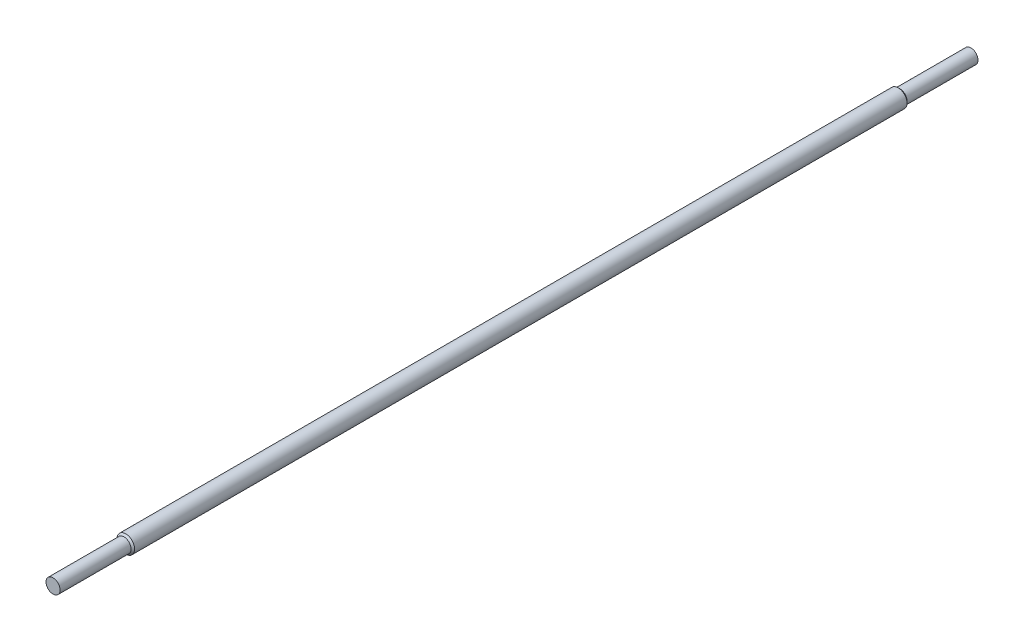
ISO-10303-21;
HEADER;
FILE_DESCRIPTION(('STEP AP214'),'2;1');
FILE_NAME('part.step','',(''),(''),'','','');
FILE_SCHEMA(('AUTOMOTIVE_DESIGN { 1 0 10303 214 1 1 1 1 }'));
ENDSEC;
DATA;
#1=APPLICATION_CONTEXT('core data for automotive mechanical design processes');
#2=APPLICATION_PROTOCOL_DEFINITION('international standard','automotive_design',2000,#1);
#3=PRODUCT_CONTEXT('',#1,'mechanical');
#4=PRODUCT('Part','Part','',(#3));
#5=PRODUCT_RELATED_PRODUCT_CATEGORY('part','',(#4));
#6=PRODUCT_DEFINITION_FORMATION('','',#4);
#7=PRODUCT_DEFINITION_CONTEXT('part definition',#1,'design');
#8=PRODUCT_DEFINITION('design','',#6,#7);
#9=PRODUCT_DEFINITION_SHAPE('','',#8);
#10=(LENGTH_UNIT() NAMED_UNIT(*) SI_UNIT(.MILLI.,.METRE.));
#11=(NAMED_UNIT(*) PLANE_ANGLE_UNIT() SI_UNIT($,.RADIAN.));
#12=(NAMED_UNIT(*) SI_UNIT($,.STERADIAN.) SOLID_ANGLE_UNIT());
#13=UNCERTAINTY_MEASURE_WITH_UNIT(LENGTH_MEASURE(1.E-05),#10,'distance_accuracy_value','');
#14=(GEOMETRIC_REPRESENTATION_CONTEXT(3) GLOBAL_UNCERTAINTY_ASSIGNED_CONTEXT((#13)) GLOBAL_UNIT_ASSIGNED_CONTEXT((#10,
#11,#12)) REPRESENTATION_CONTEXT('',''));
#15=CARTESIAN_POINT('',(0.,0.,0.));
#16=DIRECTION('',(0.,0.,1.));
#17=DIRECTION('',(1.,0.,0.));
#18=AXIS2_PLACEMENT_3D('',#15,#16,#17);
#19=CARTESIAN_POINT('',(0.,0.,825.5));
#20=DIRECTION('',(0.,0.,-1.));
#21=DIRECTION('',(-1.,0.,0.));
#22=AXIS2_PLACEMENT_3D('',#19,#20,#21);
#23=CYLINDRICAL_SURFACE('',#22,15.875);
#24=CARTESIAN_POINT('',(0.,0.,-694.69));
#25=DIRECTION('',(0.,0.,-1.));
#26=DIRECTION('',(-1.,0.,0.));
#27=AXIS2_PLACEMENT_3D('',#24,#25,#26);
#28=CIRCLE('',#27,15.875);
#29=CARTESIAN_POINT('',(15.8750000000001,0.,-694.69));
#30=VERTEX_POINT('',#29);
#31=EDGE_CURVE('E42',#30,#30,#28,.F.);
#32=ORIENTED_EDGE('',*,*,#31,.T.);
#33=EDGE_LOOP('',(#32));
#34=FACE_BOUND('',#33,.T.);
#35=CARTESIAN_POINT('',(0.,0.,694.69));
#36=DIRECTION('',(0.,0.,1.));
#37=DIRECTION('',(1.,0.,0.));
#38=AXIS2_PLACEMENT_3D('',#35,#36,#37);
#39=CIRCLE('',#38,15.875);
#40=CARTESIAN_POINT('',(15.875,0.,694.69));
#41=VERTEX_POINT('',#40);
#42=EDGE_CURVE('E46',#41,#41,#39,.F.);
#43=ORIENTED_EDGE('',*,*,#42,.T.);
#44=EDGE_LOOP('',(#43));
#45=FACE_BOUND('',#44,.T.);
#46=ADVANCED_FACE('F31',(#34,#45),#23,.T.);
#47=CARTESIAN_POINT('',(0.,0.,698.5));
#48=DIRECTION('',(0.,0.,1.));
#49=DIRECTION('',(1.,0.,0.));
#50=AXIS2_PLACEMENT_3D('',#47,#48,#49);
#51=CYLINDRICAL_SURFACE('',#50,12.7);
#52=CARTESIAN_POINT('',(0.,0.,697.865));
#53=DIRECTION('',(0.,0.,-1.));
#54=DIRECTION('',(-1.,0.,0.));
#55=AXIS2_PLACEMENT_3D('',#52,#53,#54);
#56=CIRCLE('',#55,12.7);
#57=CARTESIAN_POINT('',(-12.7,0.,697.865));
#58=VERTEX_POINT('',#57);
#59=EDGE_CURVE('E10',#58,#58,#56,.F.);
#60=ORIENTED_EDGE('',*,*,#59,.T.);
#61=EDGE_LOOP('',(#60));
#62=FACE_BOUND('',#61,.T.);
#63=CARTESIAN_POINT('',(0.,0.,825.5));
#64=DIRECTION('',(0.,0.,1.));
#65=DIRECTION('',(1.,0.,0.));
#66=AXIS2_PLACEMENT_3D('',#63,#64,#65);
#67=CIRCLE('',#66,12.7);
#68=CARTESIAN_POINT('',(12.7,0.,825.5));
#69=VERTEX_POINT('',#68);
#70=EDGE_CURVE('E51',#69,#69,#67,.T.);
#71=ORIENTED_EDGE('',*,*,#70,.F.);
#72=EDGE_LOOP('',(#71));
#73=FACE_BOUND('',#72,.T.);
#74=ADVANCED_FACE('F74',(#62,#73),#51,.T.);
#75=CARTESIAN_POINT('',(0.,0.,825.5));
#76=DIRECTION('',(0.,0.,1.));
#77=DIRECTION('',(1.,0.,0.));
#78=AXIS2_PLACEMENT_3D('',#75,#76,#77);
#79=PLANE('',#78);
#80=ORIENTED_EDGE('',*,*,#70,.T.);
#81=EDGE_LOOP('',(#80));
#82=FACE_BOUND('',#81,.T.);
#83=ADVANCED_FACE('F69',(#82),#79,.T.);
#84=CARTESIAN_POINT('',(0.,0.,-698.5));
#85=DIRECTION('',(0.,0.,-1.));
#86=DIRECTION('',(-1.,0.,0.));
#87=AXIS2_PLACEMENT_3D('',#84,#85,#86);
#88=CYLINDRICAL_SURFACE('',#87,12.7);
#89=CARTESIAN_POINT('',(0.,0.,-697.865));
#90=DIRECTION('',(0.,0.,1.));
#91=DIRECTION('',(1.,0.,0.));
#92=AXIS2_PLACEMENT_3D('',#89,#90,#91);
#93=CIRCLE('',#92,12.7);
#94=CARTESIAN_POINT('',(12.6999999999999,0.,-697.865));
#95=VERTEX_POINT('',#94);
#96=EDGE_CURVE('E38',#95,#95,#93,.F.);
#97=ORIENTED_EDGE('',*,*,#96,.T.);
#98=EDGE_LOOP('',(#97));
#99=FACE_BOUND('',#98,.T.);
#100=CARTESIAN_POINT('',(0.,0.,-825.5));
#101=DIRECTION('',(0.,0.,1.));
#102=DIRECTION('',(1.,0.,0.));
#103=AXIS2_PLACEMENT_3D('',#100,#101,#102);
#104=CIRCLE('',#103,12.7);
#105=CARTESIAN_POINT('',(12.7,0.,-825.5));
#106=VERTEX_POINT('',#105);
#107=EDGE_CURVE('E54',#106,#106,#104,.T.);
#108=ORIENTED_EDGE('',*,*,#107,.T.);
#109=EDGE_LOOP('',(#108));
#110=FACE_BOUND('',#109,.T.);
#111=ADVANCED_FACE('F58',(#99,#110),#88,.T.);
#112=CARTESIAN_POINT('',(0.,0.,-825.5));
#113=DIRECTION('',(0.,0.,1.));
#114=DIRECTION('',(1.,0.,0.));
#115=AXIS2_PLACEMENT_3D('',#112,#113,#114);
#116=PLANE('',#115);
#117=ORIENTED_EDGE('',*,*,#107,.F.);
#118=EDGE_LOOP('',(#117));
#119=FACE_BOUND('',#118,.T.);
#120=ADVANCED_FACE('F60',(#119),#116,.F.);
#121=CARTESIAN_POINT('',(0.,0.,-698.5));
#122=DIRECTION('',(0.,0.,1.));
#123=DIRECTION('',(1.,0.,0.));
#124=AXIS2_PLACEMENT_3D('',#121,#122,#123);
#125=CONICAL_SURFACE('',#124,12.0649999999999,0.785398163397445);
#126=CARTESIAN_POINT('',(15.8750000000001,0.,-694.69));
#127=CARTESIAN_POINT('',(15.8419270833334,0.,-694.723072916667));
#128=CARTESIAN_POINT('',(15.8088541666667,0.,-694.756145833333));
#129=CARTESIAN_POINT('',(15.7427083333334,0.,-694.822291666667));
#130=CARTESIAN_POINT('',(15.7096354166667,0.,-694.855364583333));
#131=CARTESIAN_POINT('',(15.6434895833334,0.,-694.921510416666));
#132=CARTESIAN_POINT('',(15.6104166666667,0.,-694.954583333333));
#133=CARTESIAN_POINT('',(15.5442708333334,0.,-695.020729166667));
#134=CARTESIAN_POINT('',(15.5111979166667,0.,-695.053802083333));
#135=CARTESIAN_POINT('',(15.4450520833334,0.,-695.119947916667));
#136=CARTESIAN_POINT('',(15.4119791666667,0.,-695.153020833333));
#137=CARTESIAN_POINT('',(15.3458333333334,0.,-695.219166666667));
#138=CARTESIAN_POINT('',(15.3127604166667,0.,-695.252239583333));
#139=CARTESIAN_POINT('',(15.2466145833334,0.,-695.318385416667));
#140=CARTESIAN_POINT('',(15.2135416666667,0.,-695.351458333333));
#141=CARTESIAN_POINT('',(15.1473958333334,0.,-695.417604166667));
#142=CARTESIAN_POINT('',(15.1143229166667,0.,-695.450677083333));
#143=CARTESIAN_POINT('',(15.0481770833334,0.,-695.516822916667));
#144=CARTESIAN_POINT('',(15.0151041666667,0.,-695.549895833333));
#145=CARTESIAN_POINT('',(14.9489583333333,0.,-695.616041666667));
#146=CARTESIAN_POINT('',(14.9158854166667,0.,-695.649114583333));
#147=CARTESIAN_POINT('',(14.8497395833333,0.,-695.715260416667));
#148=CARTESIAN_POINT('',(14.8166666666667,0.,-695.748333333333));
#149=CARTESIAN_POINT('',(14.7505208333334,0.,-695.814479166667));
#150=CARTESIAN_POINT('',(14.7174479166667,0.,-695.847552083333));
#151=CARTESIAN_POINT('',(14.6513020833333,0.,-695.913697916667));
#152=CARTESIAN_POINT('',(14.6182291666667,0.,-695.946770833333));
#153=CARTESIAN_POINT('',(14.5520833333333,0.,-696.012916666667));
#154=CARTESIAN_POINT('',(14.5190104166667,0.,-696.045989583333));
#155=CARTESIAN_POINT('',(14.4528645833333,0.,-696.112135416667));
#156=CARTESIAN_POINT('',(14.4197916666667,0.,-696.145208333333));
#157=CARTESIAN_POINT('',(14.3536458333333,0.,-696.211354166667));
#158=CARTESIAN_POINT('',(14.3205729166667,0.,-696.244427083333));
#159=CARTESIAN_POINT('',(14.2544270833333,0.,-696.310572916667));
#160=CARTESIAN_POINT('',(14.2213541666667,0.,-696.343645833333));
#161=CARTESIAN_POINT('',(14.1552083333333,0.,-696.409791666667));
#162=CARTESIAN_POINT('',(14.1221354166666,0.,-696.442864583333));
#163=CARTESIAN_POINT('',(14.0559895833333,0.,-696.509010416667));
#164=CARTESIAN_POINT('',(14.0229166666667,0.,-696.542083333333));
#165=CARTESIAN_POINT('',(13.9567708333333,0.,-696.608229166667));
#166=CARTESIAN_POINT('',(13.9236979166666,0.,-696.641302083333));
#167=CARTESIAN_POINT('',(13.8575520833333,0.,-696.707447916667));
#168=CARTESIAN_POINT('',(13.8244791666666,0.,-696.740520833333));
#169=CARTESIAN_POINT('',(13.7583333333333,0.,-696.806666666667));
#170=CARTESIAN_POINT('',(13.7252604166666,0.,-696.839739583333));
#171=CARTESIAN_POINT('',(13.6591145833333,0.,-696.905885416667));
#172=CARTESIAN_POINT('',(13.6260416666666,0.,-696.938958333333));
#173=CARTESIAN_POINT('',(13.5598958333333,0.,-697.005104166667));
#174=CARTESIAN_POINT('',(13.5268229166666,0.,-697.038177083333));
#175=CARTESIAN_POINT('',(13.4606770833333,0.,-697.104322916667));
#176=CARTESIAN_POINT('',(13.4276041666666,0.,-697.137395833333));
#177=CARTESIAN_POINT('',(13.3614583333333,0.,-697.203541666667));
#178=CARTESIAN_POINT('',(13.3283854166666,0.,-697.236614583333));
#179=CARTESIAN_POINT('',(13.2622395833333,0.,-697.302760416667));
#180=CARTESIAN_POINT('',(13.2291666666666,0.,-697.335833333333));
#181=CARTESIAN_POINT('',(13.1630208333333,0.,-697.401979166667));
#182=CARTESIAN_POINT('',(13.1299479166666,0.,-697.435052083333));
#183=CARTESIAN_POINT('',(13.0638020833333,0.,-697.501197916667));
#184=CARTESIAN_POINT('',(13.0307291666666,0.,-697.534270833333));
#185=CARTESIAN_POINT('',(12.9645833333333,0.,-697.600416666667));
#186=CARTESIAN_POINT('',(12.9315104166666,0.,-697.633489583333));
#187=CARTESIAN_POINT('',(12.8653645833333,0.,-697.699635416667));
#188=CARTESIAN_POINT('',(12.8322916666666,0.,-697.732708333333));
#189=CARTESIAN_POINT('',(12.7661458333332,0.,-697.798854166667));
#190=CARTESIAN_POINT('',(12.7330729166666,0.,-697.831927083333));
#191=CARTESIAN_POINT('',(12.6999999999999,0.,-697.865));
#192=B_SPLINE_CURVE_WITH_KNOTS('',3,(#126,#127,#128,#129,#130,#131,#132,#133,#134,#135,#136,
#137,#138,#139,#140,#141,#142,#143,#144,#145,#146,#147,#148,#149,#150,#151,#152,#153,#154,#155,
#156,#157,#158,#159,#160,#161,#162,#163,#164,#165,#166,#167,#168,#169,#170,#171,#172,#173,#174,
#175,#176,#177,#178,#179,#180,#181,#182,#183,#184,#185,#186,#187,#188,#189,#190,#191),
.UNSPECIFIED.,.F.,.F.,(4,2,2,2,2,2,2,2,2,2,2,2,2,2,2,2,2,2,2,2,2,2,2,2,2,2,2,2,2,2,2,2,4),(0.,
0.140316501891683,0.280633003783365,0.420949505675125,0.561266007566807,0.70158250945849,
0.841899011350251,0.982215513241932,1.12253201513369,1.26284851702538,1.40316501891706,
1.54348152080882,1.6837980227005,1.82411452459218,1.96443102648394,2.10474752837563,
2.24506403026739,2.38538053215907,2.52569703405075,2.66601353594251,2.8063300378342,
2.94664653972588,3.08696304161764,3.22727954350932,3.36759604540108,3.50791254729276,
3.64822904918445,3.78854555107621,3.92886205296789,4.06917855485957,4.20949505675133,
4.34981155864302,4.49012806053478),.UNSPECIFIED.);
#193=EDGE_CURVE('BSEAM62',#30,#95,#192,.T.);
#194=ORIENTED_EDGE('',*,*,#31,.F.);
#195=ORIENTED_EDGE('',*,*,#96,.F.);
#196=ORIENTED_EDGE('',*,*,#193,.T.);
#197=ORIENTED_EDGE('',*,*,#193,.F.);
#198=EDGE_LOOP('',(#194,#196,#195,#197));
#199=FACE_BOUND('',#198,.T.);
#200=ADVANCED_FACE('F62',(#199),#125,.T.);
#201=CARTESIAN_POINT('',(0.,0.,698.5));
#202=DIRECTION('',(0.,0.,-1.));
#203=DIRECTION('',(-1.,0.,0.));
#204=AXIS2_PLACEMENT_3D('',#201,#202,#203);
#205=CONICAL_SURFACE('',#204,12.0649999999999,0.78539816339746);
#206=ORIENTED_EDGE('',*,*,#42,.F.);
#207=EDGE_LOOP('',(#206));
#208=FACE_BOUND('',#207,.T.);
#209=ORIENTED_EDGE('',*,*,#59,.F.);
#210=EDGE_LOOP('',(#209));
#211=FACE_BOUND('',#210,.T.);
#212=ADVANCED_FACE('F33',(#208,#211),#205,.T.);
#213=CLOSED_SHELL('',(#46,#74,#83,#111,#120,#200,#212));
#214=MANIFOLD_SOLID_BREP('B2',#213);
#215=ADVANCED_BREP_SHAPE_REPRESENTATION('',(#18,#214),#14);
#216=SHAPE_DEFINITION_REPRESENTATION(#9,#215);
ENDSEC;
END-ISO-10303-21;
